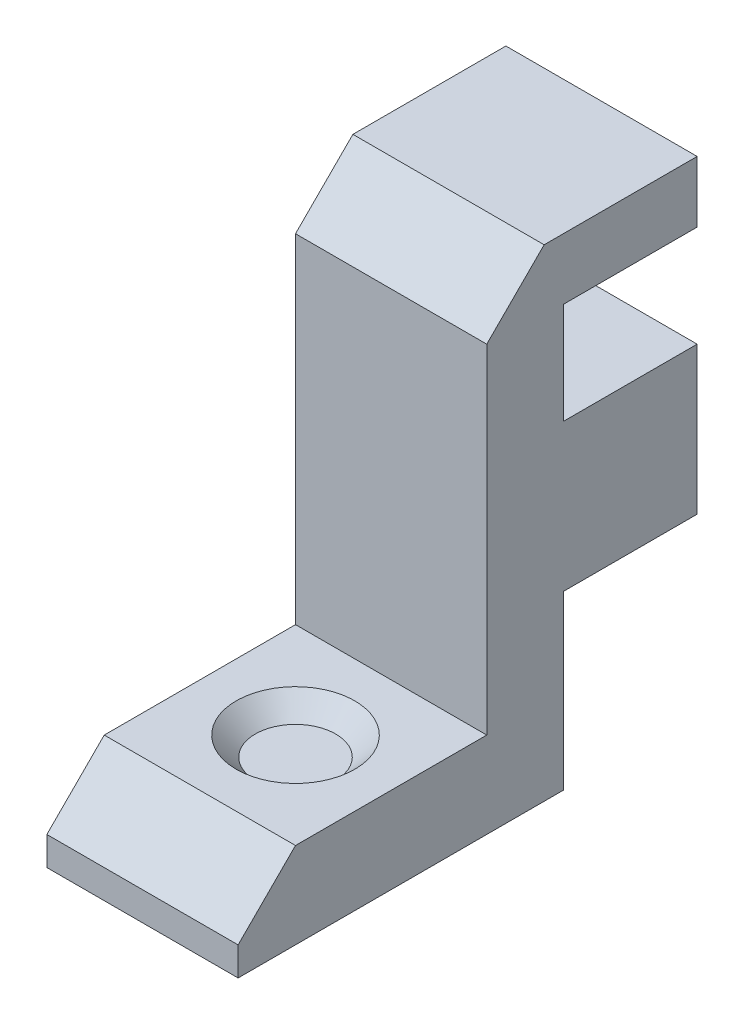
ISO-10303-21;
HEADER;
FILE_DESCRIPTION(('STEP AP214'),'2;1');
FILE_NAME('part.step','',(''),(''),'','','');
FILE_SCHEMA(('AUTOMOTIVE_DESIGN { 1 0 10303 214 1 1 1 1 }'));
ENDSEC;
DATA;
#1=APPLICATION_CONTEXT('core data for automotive mechanical design processes');
#2=APPLICATION_PROTOCOL_DEFINITION('international standard','automotive_design',2000,#1);
#3=PRODUCT_CONTEXT('',#1,'mechanical');
#4=PRODUCT('Part','Part','',(#3));
#5=PRODUCT_RELATED_PRODUCT_CATEGORY('part','',(#4));
#6=PRODUCT_DEFINITION_FORMATION('','',#4);
#7=PRODUCT_DEFINITION_CONTEXT('part definition',#1,'design');
#8=PRODUCT_DEFINITION('design','',#6,#7);
#9=PRODUCT_DEFINITION_SHAPE('','',#8);
#10=(LENGTH_UNIT() NAMED_UNIT(*) SI_UNIT(.MILLI.,.METRE.));
#11=(NAMED_UNIT(*) PLANE_ANGLE_UNIT() SI_UNIT($,.RADIAN.));
#12=(NAMED_UNIT(*) SI_UNIT($,.STERADIAN.) SOLID_ANGLE_UNIT());
#13=UNCERTAINTY_MEASURE_WITH_UNIT(LENGTH_MEASURE(1.E-05),#10,'distance_accuracy_value','');
#14=(GEOMETRIC_REPRESENTATION_CONTEXT(3) GLOBAL_UNCERTAINTY_ASSIGNED_CONTEXT((#13)) GLOBAL_UNIT_ASSIGNED_CONTEXT((#10,
#11,#12)) REPRESENTATION_CONTEXT('',''));
#15=CARTESIAN_POINT('',(0.,0.,0.));
#16=DIRECTION('',(0.,0.,1.));
#17=DIRECTION('',(1.,0.,0.));
#18=AXIS2_PLACEMENT_3D('',#15,#16,#17);
#19=CARTESIAN_POINT('',(0.,0.,4.));
#20=DIRECTION('',(0.,0.,-1.));
#21=DIRECTION('',(-1.,0.,0.));
#22=AXIS2_PLACEMENT_3D('',#19,#20,#21);
#23=PLANE('',#22);
#24=DIRECTION('',(0.,1.,0.));
#25=VECTOR('',#24,1.);
#26=CARTESIAN_POINT('',(10.,0.,4.));
#27=LINE('',#26,#25);
#28=CARTESIAN_POINT('',(10.,4.5,4.));
#29=VERTEX_POINT('',#28);
#30=CARTESIAN_POINT('',(10.,22.2,4.));
#31=VERTEX_POINT('',#30);
#32=EDGE_CURVE('E264',#29,#31,#27,.T.);
#33=ORIENTED_EDGE('',*,*,#32,.T.);
#34=DIRECTION('',(-1.,0.,0.));
#35=VECTOR('',#34,1.);
#36=CARTESIAN_POINT('',(0.,22.2,4.));
#37=LINE('',#36,#35);
#38=CARTESIAN_POINT('',(0.,22.2,4.));
#39=VERTEX_POINT('',#38);
#40=EDGE_CURVE('E62',#31,#39,#37,.T.);
#41=ORIENTED_EDGE('',*,*,#40,.T.);
#42=DIRECTION('',(0.,-1.,0.));
#43=VECTOR('',#42,1.);
#44=CARTESIAN_POINT('',(0.,0.,4.));
#45=LINE('',#44,#43);
#46=CARTESIAN_POINT('',(0.,4.5,4.));
#47=VERTEX_POINT('',#46);
#48=EDGE_CURVE('E265',#39,#47,#45,.T.);
#49=ORIENTED_EDGE('',*,*,#48,.T.);
#50=DIRECTION('',(-1.,0.,0.));
#51=VECTOR('',#50,1.);
#52=CARTESIAN_POINT('',(0.,4.5,4.));
#53=LINE('',#52,#51);
#54=EDGE_CURVE('E167',#29,#47,#53,.T.);
#55=ORIENTED_EDGE('',*,*,#54,.F.);
#56=EDGE_LOOP('',(#33,#41,#49,#55));
#57=FACE_BOUND('',#56,.T.);
#58=ADVANCED_FACE('F51',(#57),#23,.F.);
#59=CARTESIAN_POINT('',(0.,0.,0.));
#60=DIRECTION('',(0.,0.,-1.));
#61=DIRECTION('',(-1.,0.,0.));
#62=AXIS2_PLACEMENT_3D('',#59,#60,#61);
#63=PLANE('',#62);
#64=DIRECTION('',(-1.,0.,0.));
#65=VECTOR('',#64,1.);
#66=CARTESIAN_POINT('',(10.,22.,0.));
#67=LINE('',#66,#65);
#68=CARTESIAN_POINT('',(10.,22.,0.));
#69=VERTEX_POINT('',#68);
#70=CARTESIAN_POINT('',(0.,22.,0.));
#71=VERTEX_POINT('',#70);
#72=EDGE_CURVE('E202',#69,#71,#67,.T.);
#73=ORIENTED_EDGE('',*,*,#72,.F.);
#74=DIRECTION('',(0.,1.,0.));
#75=VECTOR('',#74,1.);
#76=CARTESIAN_POINT('',(10.,0.,0.));
#77=LINE('',#76,#75);
#78=CARTESIAN_POINT('',(10.,16.7,0.));
#79=VERTEX_POINT('',#78);
#80=EDGE_CURVE('E277',#79,#69,#77,.T.);
#81=ORIENTED_EDGE('',*,*,#80,.F.);
#82=DIRECTION('',(1.,0.,0.));
#83=VECTOR('',#82,1.);
#84=CARTESIAN_POINT('',(10.,16.7,0.));
#85=LINE('',#84,#83);
#86=CARTESIAN_POINT('',(0.,16.7,0.));
#87=VERTEX_POINT('',#86);
#88=EDGE_CURVE('E243',#87,#79,#85,.T.);
#89=ORIENTED_EDGE('',*,*,#88,.F.);
#90=DIRECTION('',(0.,-1.,0.));
#91=VECTOR('',#90,1.);
#92=CARTESIAN_POINT('',(0.,0.,0.));
#93=LINE('',#92,#91);
#94=EDGE_CURVE('E275',#71,#87,#93,.T.);
#95=ORIENTED_EDGE('',*,*,#94,.F.);
#96=EDGE_LOOP('',(#73,#81,#89,#95));
#97=FACE_BOUND('',#96,.T.);
#98=ADVANCED_FACE('F335',(#97),#63,.T.);
#99=CARTESIAN_POINT('',(0.,0.,4.));
#100=DIRECTION('',(1.,0.,0.));
#101=DIRECTION('',(0.,0.,-1.));
#102=AXIS2_PLACEMENT_3D('',#99,#100,#101);
#103=PLANE('',#102);
#104=DIRECTION('',(0.,-1.,0.));
#105=VECTOR('',#104,1.);
#106=CARTESIAN_POINT('',(0.,0.,17.));
#107=LINE('',#106,#105);
#108=CARTESIAN_POINT('',(0.,1.5,17.));
#109=VERTEX_POINT('',#108);
#110=CARTESIAN_POINT('',(0.,0.,17.));
#111=VERTEX_POINT('',#110);
#112=EDGE_CURVE('E154',#109,#111,#107,.T.);
#113=ORIENTED_EDGE('',*,*,#112,.F.);
#114=DIRECTION('',(0.,-0.707106781186546,0.707106781186549));
#115=VECTOR('',#114,1.);
#116=CARTESIAN_POINT('',(0.,1.5,17.));
#117=LINE('',#116,#115);
#118=CARTESIAN_POINT('',(0.,4.5,14.));
#119=VERTEX_POINT('',#118);
#120=EDGE_CURVE('E293',#109,#119,#117,.F.);
#121=ORIENTED_EDGE('',*,*,#120,.T.);
#122=DIRECTION('',(0.,0.,-1.));
#123=VECTOR('',#122,1.);
#124=CARTESIAN_POINT('',(0.,4.5,17.));
#125=LINE('',#124,#123);
#126=EDGE_CURVE('E183',#119,#47,#125,.T.);
#127=ORIENTED_EDGE('',*,*,#126,.T.);
#128=ORIENTED_EDGE('',*,*,#48,.F.);
#129=DIRECTION('',(0.,-0.707106781186546,0.707106781186549));
#130=VECTOR('',#129,1.);
#131=CARTESIAN_POINT('',(0.,22.2,4.));
#132=LINE('',#131,#130);
#133=CARTESIAN_POINT('',(0.,25.2,0.99999999999999));
#134=VERTEX_POINT('',#133);
#135=EDGE_CURVE('E295',#39,#134,#132,.F.);
#136=ORIENTED_EDGE('',*,*,#135,.T.);
#137=DIRECTION('',(0.,0.,-1.));
#138=VECTOR('',#137,1.);
#139=CARTESIAN_POINT('',(0.,25.2,4.));
#140=LINE('',#139,#138);
#141=CARTESIAN_POINT('',(0.,25.2,-7.));
#142=VERTEX_POINT('',#141);
#143=EDGE_CURVE('E267',#134,#142,#140,.T.);
#144=ORIENTED_EDGE('',*,*,#143,.T.);
#145=DIRECTION('',(0.,1.,0.));
#146=VECTOR('',#145,1.);
#147=CARTESIAN_POINT('',(0.,25.2,-7.));
#148=LINE('',#147,#146);
#149=CARTESIAN_POINT('',(0.,22.,-7.));
#150=VERTEX_POINT('',#149);
#151=EDGE_CURVE('E208',#150,#142,#148,.T.);
#152=ORIENTED_EDGE('',*,*,#151,.F.);
#153=DIRECTION('',(0.,0.,1.));
#154=VECTOR('',#153,1.);
#155=CARTESIAN_POINT('',(0.,22.,-7.));
#156=LINE('',#155,#154);
#157=EDGE_CURVE('E216',#150,#71,#156,.T.);
#158=ORIENTED_EDGE('',*,*,#157,.T.);
#159=ORIENTED_EDGE('',*,*,#94,.T.);
#160=DIRECTION('',(0.,0.,1.));
#161=VECTOR('',#160,1.);
#162=CARTESIAN_POINT('',(0.,16.7,-7.));
#163=LINE('',#162,#161);
#164=CARTESIAN_POINT('',(0.,16.7,-7.));
#165=VERTEX_POINT('',#164);
#166=EDGE_CURVE('E232',#165,#87,#163,.T.);
#167=ORIENTED_EDGE('',*,*,#166,.F.);
#168=DIRECTION('',(0.,1.,0.));
#169=VECTOR('',#168,1.);
#170=CARTESIAN_POINT('',(0.,16.7,-7.));
#171=LINE('',#170,#169);
#172=CARTESIAN_POINT('',(0.,9.,-7.));
#173=VERTEX_POINT('',#172);
#174=EDGE_CURVE('E251',#173,#165,#171,.T.);
#175=ORIENTED_EDGE('',*,*,#174,.F.);
#176=DIRECTION('',(0.,0.,1.));
#177=VECTOR('',#176,1.);
#178=CARTESIAN_POINT('',(0.,9.,-7.));
#179=LINE('',#178,#177);
#180=CARTESIAN_POINT('',(0.,9.,0.));
#181=VERTEX_POINT('',#180);
#182=EDGE_CURVE('E231',#173,#181,#179,.T.);
#183=ORIENTED_EDGE('',*,*,#182,.T.);
#184=CARTESIAN_POINT('',(0.,0.,0.));
#185=VERTEX_POINT('',#184);
#186=EDGE_CURVE('E175',#181,#185,#93,.T.);
#187=ORIENTED_EDGE('',*,*,#186,.T.);
#188=DIRECTION('',(0.,0.,-1.));
#189=VECTOR('',#188,1.);
#190=CARTESIAN_POINT('',(0.,0.,4.));
#191=LINE('',#190,#189);
#192=EDGE_CURVE('E166',#111,#185,#191,.T.);
#193=ORIENTED_EDGE('',*,*,#192,.F.);
#194=EDGE_LOOP('',(#113,#121,#127,#128,#136,#144,#152,#158,#159,#167,#175,#183,#187,#193));
#195=FACE_BOUND('',#194,.T.);
#196=ADVANCED_FACE('F168',(#195),#103,.F.);
#197=CARTESIAN_POINT('',(0.,0.,4.));
#198=DIRECTION('',(0.,1.,0.));
#199=DIRECTION('',(0.,0.,1.));
#200=AXIS2_PLACEMENT_3D('',#197,#198,#199);
#201=PLANE('',#200);
#202=DIRECTION('',(1.,0.,0.));
#203=VECTOR('',#202,1.);
#204=CARTESIAN_POINT('',(0.,0.,0.));
#205=LINE('',#204,#203);
#206=CARTESIAN_POINT('',(10.,0.,0.));
#207=VERTEX_POINT('',#206);
#208=EDGE_CURVE('E272',#185,#207,#205,.T.);
#209=ORIENTED_EDGE('',*,*,#208,.T.);
#210=DIRECTION('',(0.,0.,-1.));
#211=VECTOR('',#210,1.);
#212=CARTESIAN_POINT('',(10.,0.,4.));
#213=LINE('',#212,#211);
#214=CARTESIAN_POINT('',(10.,0.,17.));
#215=VERTEX_POINT('',#214);
#216=EDGE_CURVE('E180',#215,#207,#213,.T.);
#217=ORIENTED_EDGE('',*,*,#216,.F.);
#218=DIRECTION('',(1.,0.,0.));
#219=VECTOR('',#218,1.);
#220=CARTESIAN_POINT('',(0.,0.,17.));
#221=LINE('',#220,#219);
#222=EDGE_CURVE('E159',#111,#215,#221,.T.);
#223=ORIENTED_EDGE('',*,*,#222,.F.);
#224=ORIENTED_EDGE('',*,*,#192,.T.);
#225=EDGE_LOOP('',(#209,#217,#223,#224));
#226=FACE_BOUND('',#225,.T.);
#227=ADVANCED_FACE('F177',(#226),#201,.F.);
#228=CARTESIAN_POINT('',(10.,0.,4.));
#229=DIRECTION('',(-1.,0.,0.));
#230=DIRECTION('',(0.,0.,1.));
#231=AXIS2_PLACEMENT_3D('',#228,#229,#230);
#232=PLANE('',#231);
#233=DIRECTION('',(0.,0.,-1.));
#234=VECTOR('',#233,1.);
#235=CARTESIAN_POINT('',(10.,4.5,17.));
#236=LINE('',#235,#234);
#237=CARTESIAN_POINT('',(10.,4.5,14.));
#238=VERTEX_POINT('',#237);
#239=EDGE_CURVE('E198',#238,#29,#236,.T.);
#240=ORIENTED_EDGE('',*,*,#239,.F.);
#241=DIRECTION('',(0.,0.707106781186546,-0.707106781186549));
#242=VECTOR('',#241,1.);
#243=CARTESIAN_POINT('',(10.,1.5,17.));
#244=LINE('',#243,#242);
#245=CARTESIAN_POINT('',(10.,1.5,17.));
#246=VERTEX_POINT('',#245);
#247=EDGE_CURVE('E303',#238,#246,#244,.F.);
#248=ORIENTED_EDGE('',*,*,#247,.T.);
#249=DIRECTION('',(0.,1.,0.));
#250=VECTOR('',#249,1.);
#251=CARTESIAN_POINT('',(10.,0.,17.));
#252=LINE('',#251,#250);
#253=EDGE_CURVE('E185',#215,#246,#252,.T.);
#254=ORIENTED_EDGE('',*,*,#253,.F.);
#255=ORIENTED_EDGE('',*,*,#216,.T.);
#256=CARTESIAN_POINT('',(10.,9.,0.));
#257=VERTEX_POINT('',#256);
#258=EDGE_CURVE('E266',#207,#257,#77,.T.);
#259=ORIENTED_EDGE('',*,*,#258,.T.);
#260=DIRECTION('',(0.,0.,1.));
#261=VECTOR('',#260,1.);
#262=CARTESIAN_POINT('',(10.,9.,-7.));
#263=LINE('',#262,#261);
#264=CARTESIAN_POINT('',(10.,9.,-7.));
#265=VERTEX_POINT('',#264);
#266=EDGE_CURVE('E200',#265,#257,#263,.T.);
#267=ORIENTED_EDGE('',*,*,#266,.F.);
#268=DIRECTION('',(0.,-1.,0.));
#269=VECTOR('',#268,1.);
#270=CARTESIAN_POINT('',(10.,16.7,-7.));
#271=LINE('',#270,#269);
#272=CARTESIAN_POINT('',(10.,16.7,-7.));
#273=VERTEX_POINT('',#272);
#274=EDGE_CURVE('E250',#273,#265,#271,.T.);
#275=ORIENTED_EDGE('',*,*,#274,.F.);
#276=DIRECTION('',(0.,0.,1.));
#277=VECTOR('',#276,1.);
#278=CARTESIAN_POINT('',(10.,16.7,-7.));
#279=LINE('',#278,#277);
#280=EDGE_CURVE('E236',#273,#79,#279,.T.);
#281=ORIENTED_EDGE('',*,*,#280,.T.);
#282=ORIENTED_EDGE('',*,*,#80,.T.);
#283=DIRECTION('',(0.,0.,1.));
#284=VECTOR('',#283,1.);
#285=CARTESIAN_POINT('',(10.,22.,-7.));
#286=LINE('',#285,#284);
#287=CARTESIAN_POINT('',(10.,22.,-7.));
#288=VERTEX_POINT('',#287);
#289=EDGE_CURVE('E221',#288,#69,#286,.T.);
#290=ORIENTED_EDGE('',*,*,#289,.F.);
#291=DIRECTION('',(0.,-1.,0.));
#292=VECTOR('',#291,1.);
#293=CARTESIAN_POINT('',(10.,25.2,-7.));
#294=LINE('',#293,#292);
#295=CARTESIAN_POINT('',(10.,25.2,-7.));
#296=VERTEX_POINT('',#295);
#297=EDGE_CURVE('E199',#296,#288,#294,.T.);
#298=ORIENTED_EDGE('',*,*,#297,.F.);
#299=DIRECTION('',(0.,0.,-1.));
#300=VECTOR('',#299,1.);
#301=CARTESIAN_POINT('',(10.,25.2,4.));
#302=LINE('',#301,#300);
#303=CARTESIAN_POINT('',(10.,25.2,0.99999999999999));
#304=VERTEX_POINT('',#303);
#305=EDGE_CURVE('E285',#304,#296,#302,.T.);
#306=ORIENTED_EDGE('',*,*,#305,.F.);
#307=DIRECTION('',(0.,0.707106781186546,-0.707106781186549));
#308=VECTOR('',#307,1.);
#309=CARTESIAN_POINT('',(10.,22.2,4.));
#310=LINE('',#309,#308);
#311=EDGE_CURVE('E68',#304,#31,#310,.F.);
#312=ORIENTED_EDGE('',*,*,#311,.T.);
#313=ORIENTED_EDGE('',*,*,#32,.F.);
#314=EDGE_LOOP('',(#240,#248,#254,#255,#259,#267,#275,#281,#282,#290,#298,#306,#312,#313));
#315=FACE_BOUND('',#314,.T.);
#316=ADVANCED_FACE('F320',(#315),#232,.F.);
#317=CARTESIAN_POINT('',(0.,25.2,4.));
#318=DIRECTION('',(0.,-1.,0.));
#319=DIRECTION('',(0.,0.,-1.));
#320=AXIS2_PLACEMENT_3D('',#317,#318,#319);
#321=PLANE('',#320);
#322=ORIENTED_EDGE('',*,*,#143,.F.);
#323=DIRECTION('',(1.,0.,0.));
#324=VECTOR('',#323,1.);
#325=CARTESIAN_POINT('',(0.,25.2,0.99999999999999));
#326=LINE('',#325,#324);
#327=EDGE_CURVE('E11',#134,#304,#326,.T.);
#328=ORIENTED_EDGE('',*,*,#327,.T.);
#329=ORIENTED_EDGE('',*,*,#305,.T.);
#330=DIRECTION('',(1.,0.,0.));
#331=VECTOR('',#330,1.);
#332=CARTESIAN_POINT('',(10.,25.2,-7.));
#333=LINE('',#332,#331);
#334=EDGE_CURVE('E215',#142,#296,#333,.T.);
#335=ORIENTED_EDGE('',*,*,#334,.F.);
#336=EDGE_LOOP('',(#322,#328,#329,#335));
#337=FACE_BOUND('',#336,.T.);
#338=ADVANCED_FACE('F347',(#337),#321,.F.);
#339=DIRECTION('',(-1.,0.,0.));
#340=VECTOR('',#339,1.);
#341=CARTESIAN_POINT('',(10.,9.,0.));
#342=LINE('',#341,#340);
#343=EDGE_CURVE('E219',#257,#181,#342,.T.);
#344=ORIENTED_EDGE('',*,*,#343,.F.);
#345=ORIENTED_EDGE('',*,*,#258,.F.);
#346=ORIENTED_EDGE('',*,*,#208,.F.);
#347=ORIENTED_EDGE('',*,*,#186,.F.);
#348=EDGE_LOOP('',(#344,#345,#346,#347));
#349=FACE_BOUND('',#348,.T.);
#350=ADVANCED_FACE('F339',(#349),#63,.T.);
#351=CARTESIAN_POINT('',(10.,9.,-7.));
#352=DIRECTION('',(0.,1.,0.));
#353=DIRECTION('',(-1.,0.,0.));
#354=AXIS2_PLACEMENT_3D('',#351,#352,#353);
#355=PLANE('',#354);
#356=ORIENTED_EDGE('',*,*,#343,.T.);
#357=ORIENTED_EDGE('',*,*,#182,.F.);
#358=DIRECTION('',(-1.,0.,0.));
#359=VECTOR('',#358,1.);
#360=CARTESIAN_POINT('',(10.,9.,-7.));
#361=LINE('',#360,#359);
#362=EDGE_CURVE('E258',#265,#173,#361,.T.);
#363=ORIENTED_EDGE('',*,*,#362,.F.);
#364=ORIENTED_EDGE('',*,*,#266,.T.);
#365=EDGE_LOOP('',(#356,#357,#363,#364));
#366=FACE_BOUND('',#365,.T.);
#367=ADVANCED_FACE('F344',(#366),#355,.F.);
#368=CARTESIAN_POINT('',(10.,16.7,-7.));
#369=DIRECTION('',(0.,-1.,0.));
#370=DIRECTION('',(0.,0.,-1.));
#371=AXIS2_PLACEMENT_3D('',#368,#369,#370);
#372=PLANE('',#371);
#373=ORIENTED_EDGE('',*,*,#88,.T.);
#374=ORIENTED_EDGE('',*,*,#280,.F.);
#375=DIRECTION('',(1.,0.,0.));
#376=VECTOR('',#375,1.);
#377=CARTESIAN_POINT('',(10.,16.7,-7.));
#378=LINE('',#377,#376);
#379=EDGE_CURVE('E245',#165,#273,#378,.T.);
#380=ORIENTED_EDGE('',*,*,#379,.F.);
#381=ORIENTED_EDGE('',*,*,#166,.T.);
#382=EDGE_LOOP('',(#373,#374,#380,#381));
#383=FACE_BOUND('',#382,.T.);
#384=ADVANCED_FACE('F389',(#383),#372,.F.);
#385=CARTESIAN_POINT('',(0.,0.,-7.));
#386=DIRECTION('',(0.,0.,-1.));
#387=DIRECTION('',(-1.,0.,0.));
#388=AXIS2_PLACEMENT_3D('',#385,#386,#387);
#389=PLANE('',#388);
#390=ORIENTED_EDGE('',*,*,#274,.T.);
#391=ORIENTED_EDGE('',*,*,#362,.T.);
#392=ORIENTED_EDGE('',*,*,#174,.T.);
#393=ORIENTED_EDGE('',*,*,#379,.T.);
#394=EDGE_LOOP('',(#390,#391,#392,#393));
#395=FACE_BOUND('',#394,.T.);
#396=ADVANCED_FACE('F341',(#395),#389,.T.);
#397=CARTESIAN_POINT('',(10.,22.,-7.));
#398=DIRECTION('',(0.,1.,0.));
#399=DIRECTION('',(0.,0.,1.));
#400=AXIS2_PLACEMENT_3D('',#397,#398,#399);
#401=PLANE('',#400);
#402=ORIENTED_EDGE('',*,*,#72,.T.);
#403=ORIENTED_EDGE('',*,*,#157,.F.);
#404=DIRECTION('',(-1.,0.,0.));
#405=VECTOR('',#404,1.);
#406=CARTESIAN_POINT('',(10.,22.,-7.));
#407=LINE('',#406,#405);
#408=EDGE_CURVE('E204',#288,#150,#407,.T.);
#409=ORIENTED_EDGE('',*,*,#408,.F.);
#410=ORIENTED_EDGE('',*,*,#289,.T.);
#411=EDGE_LOOP('',(#402,#403,#409,#410));
#412=FACE_BOUND('',#411,.T.);
#413=ADVANCED_FACE('F405',(#412),#401,.F.);
#414=CARTESIAN_POINT('',(0.,0.,-7.));
#415=DIRECTION('',(0.,0.,-1.));
#416=DIRECTION('',(-1.,0.,0.));
#417=AXIS2_PLACEMENT_3D('',#414,#415,#416);
#418=PLANE('',#417);
#419=ORIENTED_EDGE('',*,*,#297,.T.);
#420=ORIENTED_EDGE('',*,*,#408,.T.);
#421=ORIENTED_EDGE('',*,*,#151,.T.);
#422=ORIENTED_EDGE('',*,*,#334,.T.);
#423=EDGE_LOOP('',(#419,#420,#421,#422));
#424=FACE_BOUND('',#423,.T.);
#425=ADVANCED_FACE('F409',(#424),#418,.T.);
#426=CARTESIAN_POINT('',(0.,4.5,17.));
#427=DIRECTION('',(0.,-1.,0.));
#428=DIRECTION('',(0.,0.,-1.));
#429=AXIS2_PLACEMENT_3D('',#426,#427,#428);
#430=PLANE('',#429);
#431=CARTESIAN_POINT('',(5.,4.5,9.));
#432=DIRECTION('',(0.,1.,0.));
#433=DIRECTION('',(0.,0.,1.));
#434=AXIS2_PLACEMENT_3D('',#431,#432,#433);
#435=CIRCLE('',#434,3.1);
#436=CARTESIAN_POINT('',(5.,4.5,12.1));
#437=VERTEX_POINT('',#436);
#438=EDGE_CURVE('E195',#437,#437,#435,.T.);
#439=ORIENTED_EDGE('',*,*,#438,.F.);
#440=EDGE_LOOP('',(#439));
#441=FACE_BOUND('',#440,.T.);
#442=ORIENTED_EDGE('',*,*,#126,.F.);
#443=DIRECTION('',(1.,0.,0.));
#444=VECTOR('',#443,1.);
#445=CARTESIAN_POINT('',(0.,4.5,14.));
#446=LINE('',#445,#444);
#447=EDGE_CURVE('E298',#119,#238,#446,.T.);
#448=ORIENTED_EDGE('',*,*,#447,.T.);
#449=ORIENTED_EDGE('',*,*,#239,.T.);
#450=ORIENTED_EDGE('',*,*,#54,.T.);
#451=EDGE_LOOP('',(#442,#448,#449,#450));
#452=FACE_BOUND('',#451,.T.);
#453=ADVANCED_FACE('F312',(#441,#452),#430,.F.);
#454=CARTESIAN_POINT('',(0.,0.,17.));
#455=DIRECTION('',(0.,0.,-1.));
#456=DIRECTION('',(-1.,0.,0.));
#457=AXIS2_PLACEMENT_3D('',#454,#455,#456);
#458=PLANE('',#457);
#459=ORIENTED_EDGE('',*,*,#253,.T.);
#460=DIRECTION('',(-1.,0.,0.));
#461=VECTOR('',#460,1.);
#462=CARTESIAN_POINT('',(0.,1.5,17.));
#463=LINE('',#462,#461);
#464=EDGE_CURVE('E162',#246,#109,#463,.T.);
#465=ORIENTED_EDGE('',*,*,#464,.T.);
#466=ORIENTED_EDGE('',*,*,#112,.T.);
#467=ORIENTED_EDGE('',*,*,#222,.T.);
#468=EDGE_LOOP('',(#459,#465,#466,#467));
#469=FACE_BOUND('',#468,.T.);
#470=ADVANCED_FACE('F158',(#469),#458,.F.);
#471=CARTESIAN_POINT('',(5.,3.5,9.));
#472=DIRECTION('',(0.,1.,0.));
#473=DIRECTION('',(0.,0.,1.));
#474=AXIS2_PLACEMENT_3D('',#471,#472,#473);
#475=PLANE('',#474);
#476=CARTESIAN_POINT('',(5.,3.5,9.));
#477=DIRECTION('',(0.,1.,0.));
#478=DIRECTION('',(0.,0.,1.));
#479=AXIS2_PLACEMENT_3D('',#476,#477,#478);
#480=CIRCLE('',#479,2.1);
#481=CARTESIAN_POINT('',(5.,3.5,11.1));
#482=VERTEX_POINT('',#481);
#483=EDGE_CURVE('E176',#482,#482,#480,.T.);
#484=ORIENTED_EDGE('',*,*,#483,.T.);
#485=EDGE_LOOP('',(#484));
#486=FACE_BOUND('',#485,.T.);
#487=ADVANCED_FACE('F330',(#486),#475,.T.);
#488=CARTESIAN_POINT('',(5.,3.5,9.));
#489=DIRECTION('',(0.,1.,0.));
#490=DIRECTION('',(0.,0.,1.));
#491=AXIS2_PLACEMENT_3D('',#488,#489,#490);
#492=CONICAL_SURFACE('',#491,2.1,0.785398163397454);
#493=ORIENTED_EDGE('',*,*,#438,.T.);
#494=EDGE_LOOP('',(#493));
#495=FACE_BOUND('',#494,.T.);
#496=ORIENTED_EDGE('',*,*,#483,.F.);
#497=EDGE_LOOP('',(#496));
#498=FACE_BOUND('',#497,.T.);
#499=ADVANCED_FACE('F325',(#495,#498),#492,.F.);
#500=CARTESIAN_POINT('',(0.,1.5,17.));
#501=DIRECTION('',(0.,-0.707106781186549,-0.707106781186546));
#502=DIRECTION('',(-1.,0.,0.));
#503=AXIS2_PLACEMENT_3D('',#500,#501,#502);
#504=PLANE('',#503);
#505=ORIENTED_EDGE('',*,*,#247,.F.);
#506=ORIENTED_EDGE('',*,*,#447,.F.);
#507=ORIENTED_EDGE('',*,*,#120,.F.);
#508=ORIENTED_EDGE('',*,*,#464,.F.);
#509=EDGE_LOOP('',(#505,#506,#507,#508));
#510=FACE_BOUND('',#509,.T.);
#511=ADVANCED_FACE('F319',(#510),#504,.F.);
#512=CARTESIAN_POINT('',(0.,22.2,4.));
#513=DIRECTION('',(0.,-0.707106781186549,-0.707106781186546));
#514=DIRECTION('',(-1.,0.,0.));
#515=AXIS2_PLACEMENT_3D('',#512,#513,#514);
#516=PLANE('',#515);
#517=ORIENTED_EDGE('',*,*,#311,.F.);
#518=ORIENTED_EDGE('',*,*,#327,.F.);
#519=ORIENTED_EDGE('',*,*,#135,.F.);
#520=ORIENTED_EDGE('',*,*,#40,.F.);
#521=EDGE_LOOP('',(#517,#518,#519,#520));
#522=FACE_BOUND('',#521,.T.);
#523=ADVANCED_FACE('F53',(#522),#516,.F.);
#524=CLOSED_SHELL('',(#58,#98,#196,#227,#316,#338,#350,#367,#384,#396,#413,#425,#453,#470,#487,
#499,#511,#523));
#525=MANIFOLD_SOLID_BREP('B2',#524);
#526=ADVANCED_BREP_SHAPE_REPRESENTATION('',(#18,#525),#14);
#527=SHAPE_DEFINITION_REPRESENTATION(#9,#526);
ENDSEC;
END-ISO-10303-21;
